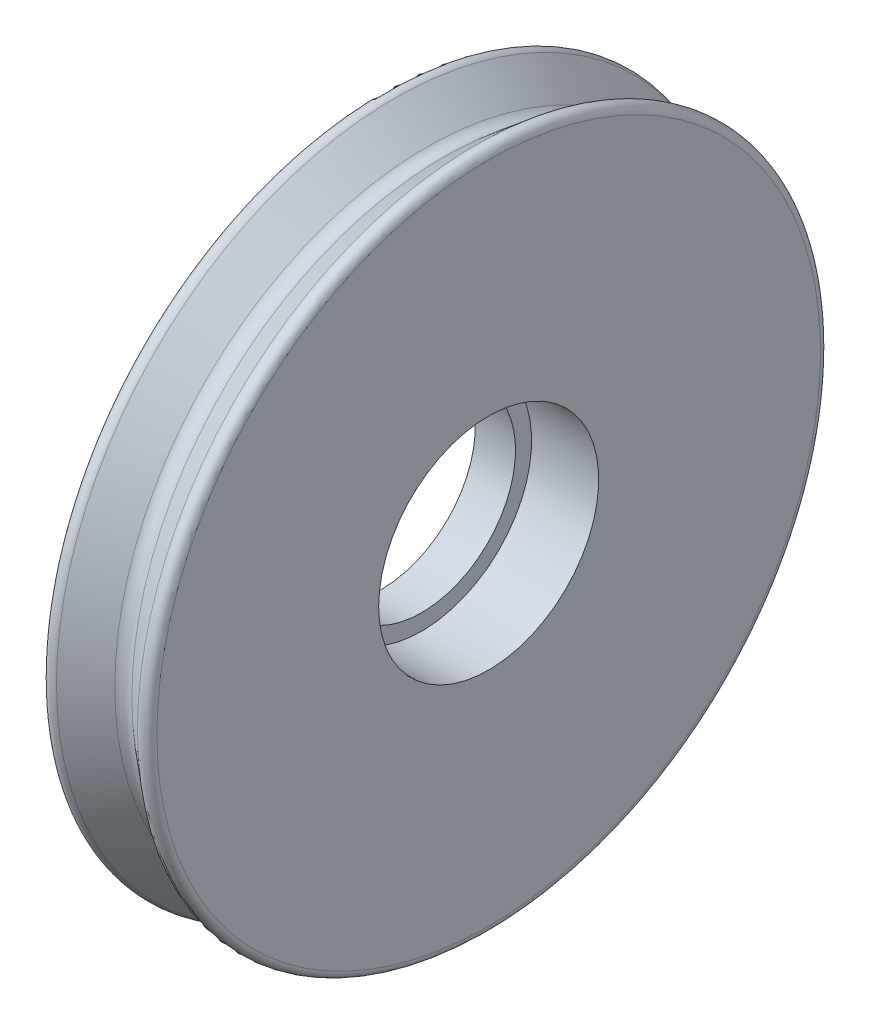
ISO-10303-21;
HEADER;
FILE_DESCRIPTION(('STEP AP214'),'2;1');
FILE_NAME('part.step','',(''),(''),'','','');
FILE_SCHEMA(('AUTOMOTIVE_DESIGN { 1 0 10303 214 1 1 1 1 }'));
ENDSEC;
DATA;
#1=APPLICATION_CONTEXT('core data for automotive mechanical design processes');
#2=APPLICATION_PROTOCOL_DEFINITION('international standard','automotive_design',2000,#1);
#3=PRODUCT_CONTEXT('',#1,'mechanical');
#4=PRODUCT('Part','Part','',(#3));
#5=PRODUCT_RELATED_PRODUCT_CATEGORY('part','',(#4));
#6=PRODUCT_DEFINITION_FORMATION('','',#4);
#7=PRODUCT_DEFINITION_CONTEXT('part definition',#1,'design');
#8=PRODUCT_DEFINITION('design','',#6,#7);
#9=PRODUCT_DEFINITION_SHAPE('','',#8);
#10=(LENGTH_UNIT() NAMED_UNIT(*) SI_UNIT(.MILLI.,.METRE.));
#11=(NAMED_UNIT(*) PLANE_ANGLE_UNIT() SI_UNIT($,.RADIAN.));
#12=(NAMED_UNIT(*) SI_UNIT($,.STERADIAN.) SOLID_ANGLE_UNIT());
#13=UNCERTAINTY_MEASURE_WITH_UNIT(LENGTH_MEASURE(1.E-05),#10,'distance_accuracy_value','');
#14=(GEOMETRIC_REPRESENTATION_CONTEXT(3) GLOBAL_UNCERTAINTY_ASSIGNED_CONTEXT((#13)) GLOBAL_UNIT_ASSIGNED_CONTEXT((#10,
#11,#12)) REPRESENTATION_CONTEXT('',''));
#15=CARTESIAN_POINT('',(0.,0.,0.));
#16=DIRECTION('',(0.,0.,1.));
#17=DIRECTION('',(1.,0.,0.));
#18=AXIS2_PLACEMENT_3D('',#15,#16,#17);
#19=CARTESIAN_POINT('',(0.,0.,0.));
#20=DIRECTION('',(-1.,0.,0.));
#21=DIRECTION('',(0.,0.,1.));
#22=AXIS2_PLACEMENT_3D('',#19,#20,#21);
#23=CYLINDRICAL_SURFACE('',#22,3.5);
#24=CARTESIAN_POINT('',(1.5,0.,0.));
#25=DIRECTION('',(-1.,0.,0.));
#26=DIRECTION('',(0.,0.,1.));
#27=AXIS2_PLACEMENT_3D('',#24,#25,#26);
#28=CIRCLE('',#27,3.5);
#29=CARTESIAN_POINT('',(1.5,0.,3.5));
#30=VERTEX_POINT('',#29);
#31=EDGE_CURVE('E52',#30,#30,#28,.T.);
#32=ORIENTED_EDGE('',*,*,#31,.F.);
#33=EDGE_LOOP('',(#32));
#34=FACE_BOUND('',#33,.T.);
#35=CARTESIAN_POINT('',(0.,0.,0.));
#36=DIRECTION('',(-1.,0.,0.));
#37=DIRECTION('',(0.,0.,1.));
#38=AXIS2_PLACEMENT_3D('',#35,#36,#37);
#39=CIRCLE('',#38,3.5);
#40=CARTESIAN_POINT('',(0.,0.,3.5));
#41=VERTEX_POINT('',#40);
#42=EDGE_CURVE('E67',#41,#41,#39,.T.);
#43=ORIENTED_EDGE('',*,*,#42,.T.);
#44=EDGE_LOOP('',(#43));
#45=FACE_BOUND('',#44,.T.);
#46=ADVANCED_FACE('F32',(#34,#45),#23,.F.);
#47=CARTESIAN_POINT('',(1.5,4.1,0.));
#48=DIRECTION('',(-1.,0.,0.));
#49=DIRECTION('',(0.,0.,1.));
#50=AXIS2_PLACEMENT_3D('',#47,#48,#49);
#51=PLANE('',#50);
#52=CARTESIAN_POINT('',(1.5,0.,0.));
#53=DIRECTION('',(-1.,0.,0.));
#54=DIRECTION('',(0.,0.,1.));
#55=AXIS2_PLACEMENT_3D('',#52,#53,#54);
#56=CIRCLE('',#55,4.1);
#57=CARTESIAN_POINT('',(1.5,0.,4.1));
#58=VERTEX_POINT('',#57);
#59=EDGE_CURVE('E55',#58,#58,#56,.T.);
#60=ORIENTED_EDGE('',*,*,#59,.F.);
#61=EDGE_LOOP('',(#60));
#62=FACE_BOUND('',#61,.T.);
#63=ORIENTED_EDGE('',*,*,#31,.T.);
#64=EDGE_LOOP('',(#63));
#65=FACE_BOUND('',#64,.T.);
#66=ADVANCED_FACE('F85',(#62,#65),#51,.F.);
#67=CARTESIAN_POINT('',(0.,0.,0.));
#68=DIRECTION('',(-1.,0.,0.));
#69=DIRECTION('',(0.,0.,1.));
#70=AXIS2_PLACEMENT_3D('',#67,#68,#69);
#71=CYLINDRICAL_SURFACE('',#70,4.1);
#72=CARTESIAN_POINT('',(4.,0.,0.));
#73=DIRECTION('',(-1.,0.,0.));
#74=DIRECTION('',(0.,0.,1.));
#75=AXIS2_PLACEMENT_3D('',#72,#73,#74);
#76=CIRCLE('',#75,4.1);
#77=CARTESIAN_POINT('',(4.,0.,4.1));
#78=VERTEX_POINT('',#77);
#79=EDGE_CURVE('E58',#78,#78,#76,.T.);
#80=ORIENTED_EDGE('',*,*,#79,.F.);
#81=EDGE_LOOP('',(#80));
#82=FACE_BOUND('',#81,.T.);
#83=ORIENTED_EDGE('',*,*,#59,.T.);
#84=EDGE_LOOP('',(#83));
#85=FACE_BOUND('',#84,.T.);
#86=ADVANCED_FACE('F91',(#82,#85),#71,.F.);
#87=CARTESIAN_POINT('',(4.,13.,0.));
#88=DIRECTION('',(-1.,0.,0.));
#89=DIRECTION('',(0.,0.,1.));
#90=AXIS2_PLACEMENT_3D('',#87,#88,#89);
#91=PLANE('',#90);
#92=CARTESIAN_POINT('',(4.,0.,0.));
#93=DIRECTION('',(-1.,0.,0.));
#94=DIRECTION('',(0.,0.,1.));
#95=AXIS2_PLACEMENT_3D('',#92,#93,#94);
#96=CIRCLE('',#95,12.3641101056459);
#97=CARTESIAN_POINT('',(4.,0.,12.3641101056459));
#98=VERTEX_POINT('',#97);
#99=EDGE_CURVE('E43',#98,#98,#96,.F.);
#100=ORIENTED_EDGE('',*,*,#99,.T.);
#101=EDGE_LOOP('',(#100));
#102=FACE_BOUND('',#101,.T.);
#103=ORIENTED_EDGE('',*,*,#79,.T.);
#104=EDGE_LOOP('',(#103));
#105=FACE_BOUND('',#104,.T.);
#106=ADVANCED_FACE('F98',(#102,#105),#91,.F.);
#107=CARTESIAN_POINT('',(4.,0.,0.));
#108=DIRECTION('',(1.,0.,0.));
#109=DIRECTION('',(0.,0.,-1.));
#110=AXIS2_PLACEMENT_3D('',#107,#108,#109);
#111=CONICAL_SURFACE('',#110,13.,0.689161014898937);
#112=CARTESIAN_POINT('',(3.50923303169378,0.,0.));
#113=DIRECTION('',(-1.,0.,0.));
#114=DIRECTION('',(0.,0.,1.));
#115=AXIS2_PLACEMENT_3D('',#112,#113,#114);
#116=CIRCLE('',#115,12.5956440422584);
#117=CARTESIAN_POINT('',(3.50923303169378,0.,12.5956440422584));
#118=VERTEX_POINT('',#117);
#119=EDGE_CURVE('E47',#118,#118,#116,.T.);
#120=ORIENTED_EDGE('',*,*,#119,.T.);
#121=EDGE_LOOP('',(#120));
#122=FACE_BOUND('',#121,.T.);
#123=CARTESIAN_POINT('',(2.31794494717703,0.,0.));
#124=DIRECTION('',(-1.,0.,0.));
#125=DIRECTION('',(0.,0.,1.));
#126=AXIS2_PLACEMENT_3D('',#123,#124,#125);
#127=CIRCLE('',#126,11.6141101056459);
#128=CARTESIAN_POINT('',(2.31794494717703,0.,11.6141101056459));
#129=VERTEX_POINT('',#128);
#130=EDGE_CURVE('E61',#129,#129,#127,.T.);
#131=ORIENTED_EDGE('',*,*,#130,.F.);
#132=EDGE_LOOP('',(#131));
#133=FACE_BOUND('',#132,.T.);
#134=ADVANCED_FACE('F102',(#122,#133),#111,.T.);
#135=CARTESIAN_POINT('',(2.,0.,0.));
#136=DIRECTION('',(-1.,0.,0.));
#137=DIRECTION('',(0.,0.,1.));
#138=AXIS2_PLACEMENT_3D('',#135,#136,#137);
#139=TOROIDAL_SURFACE('',#138,12.,0.5);
#140=CARTESIAN_POINT('',(1.68205505282297,0.,0.));
#141=DIRECTION('',(-1.,0.,0.));
#142=DIRECTION('',(0.,0.,1.));
#143=AXIS2_PLACEMENT_3D('',#140,#141,#142);
#144=CIRCLE('',#143,11.6141101056459);
#145=CARTESIAN_POINT('',(1.68205505282297,0.,11.6141101056459));
#146=VERTEX_POINT('',#145);
#147=EDGE_CURVE('E64',#146,#146,#144,.T.);
#148=ORIENTED_EDGE('',*,*,#147,.F.);
#149=EDGE_LOOP('',(#148));
#150=FACE_BOUND('',#149,.T.);
#151=ORIENTED_EDGE('',*,*,#130,.T.);
#152=EDGE_LOOP('',(#151));
#153=FACE_BOUND('',#152,.T.);
#154=ADVANCED_FACE('F82',(#150,#153),#139,.F.);
#155=CARTESIAN_POINT('',(1.68205505282297,0.,0.));
#156=DIRECTION('',(-1.,0.,0.));
#157=DIRECTION('',(0.,0.,1.));
#158=AXIS2_PLACEMENT_3D('',#155,#156,#157);
#159=CONICAL_SURFACE('',#158,11.6141101056459,0.689161014898938);
#160=CARTESIAN_POINT('',(0.49076696830622,0.,0.));
#161=DIRECTION('',(1.,0.,0.));
#162=DIRECTION('',(0.,0.,-1.));
#163=AXIS2_PLACEMENT_3D('',#160,#161,#162);
#164=CIRCLE('',#163,12.5956440422584);
#165=CARTESIAN_POINT('',(0.49076696830622,0.,-12.5956440422584));
#166=VERTEX_POINT('',#165);
#167=EDGE_CURVE('E10',#166,#166,#164,.T.);
#168=ORIENTED_EDGE('',*,*,#167,.T.);
#169=EDGE_LOOP('',(#168));
#170=FACE_BOUND('',#169,.T.);
#171=ORIENTED_EDGE('',*,*,#147,.T.);
#172=EDGE_LOOP('',(#171));
#173=FACE_BOUND('',#172,.T.);
#174=ADVANCED_FACE('F75',(#170,#173),#159,.T.);
#175=CARTESIAN_POINT('',(0.,3.5,0.));
#176=DIRECTION('',(1.,0.,0.));
#177=DIRECTION('',(0.,0.,-1.));
#178=AXIS2_PLACEMENT_3D('',#175,#176,#177);
#179=PLANE('',#178);
#180=CARTESIAN_POINT('',(0.,0.,0.));
#181=DIRECTION('',(1.,0.,0.));
#182=DIRECTION('',(0.,0.,-1.));
#183=AXIS2_PLACEMENT_3D('',#180,#181,#182);
#184=CIRCLE('',#183,12.3641101056459);
#185=CARTESIAN_POINT('',(0.,0.,-12.3641101056459));
#186=VERTEX_POINT('',#185);
#187=EDGE_CURVE('E39',#186,#186,#184,.F.);
#188=ORIENTED_EDGE('',*,*,#187,.T.);
#189=EDGE_LOOP('',(#188));
#190=FACE_BOUND('',#189,.T.);
#191=ORIENTED_EDGE('',*,*,#42,.F.);
#192=EDGE_LOOP('',(#191));
#193=FACE_BOUND('',#192,.T.);
#194=ADVANCED_FACE('F72',(#190,#193),#179,.F.);
#195=CARTESIAN_POINT('',(3.7,0.,0.));
#196=DIRECTION('',(-1.,0.,0.));
#197=DIRECTION('',(0.,0.,1.));
#198=AXIS2_PLACEMENT_3D('',#195,#196,#197);
#199=TOROIDAL_SURFACE('',#198,12.3641101056459,0.3);
#200=ORIENTED_EDGE('',*,*,#99,.F.);
#201=EDGE_LOOP('',(#200));
#202=FACE_BOUND('',#201,.T.);
#203=ORIENTED_EDGE('',*,*,#119,.F.);
#204=EDGE_LOOP('',(#203));
#205=FACE_BOUND('',#204,.T.);
#206=ADVANCED_FACE('F74',(#202,#205),#199,.T.);
#207=CARTESIAN_POINT('',(0.3,0.,0.));
#208=DIRECTION('',(1.,0.,0.));
#209=DIRECTION('',(0.,0.,-1.));
#210=AXIS2_PLACEMENT_3D('',#207,#208,#209);
#211=TOROIDAL_SURFACE('',#210,12.3641101056459,0.3);
#212=ORIENTED_EDGE('',*,*,#167,.F.);
#213=EDGE_LOOP('',(#212));
#214=FACE_BOUND('',#213,.T.);
#215=ORIENTED_EDGE('',*,*,#187,.F.);
#216=EDGE_LOOP('',(#215));
#217=FACE_BOUND('',#216,.T.);
#218=ADVANCED_FACE('F34',(#214,#217),#211,.T.);
#219=CLOSED_SHELL('',(#46,#66,#86,#106,#134,#154,#174,#194,#206,#218));
#220=MANIFOLD_SOLID_BREP('B2',#219);
#221=ADVANCED_BREP_SHAPE_REPRESENTATION('',(#18,#220),#14);
#222=SHAPE_DEFINITION_REPRESENTATION(#9,#221);
ENDSEC;
END-ISO-10303-21;
